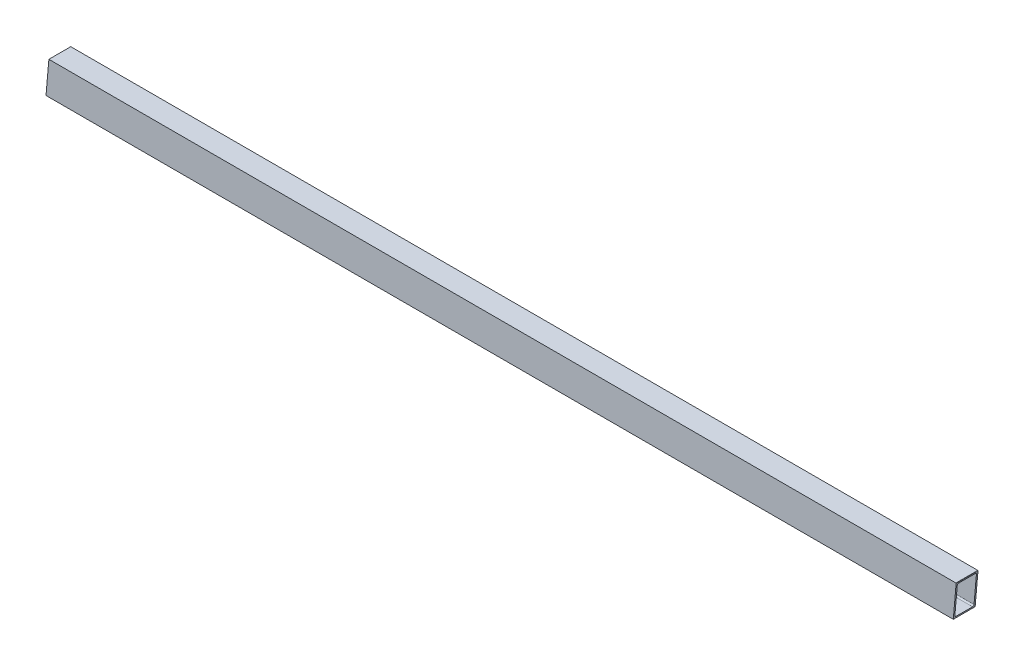
ISO-10303-21;
HEADER;
FILE_DESCRIPTION(('STEP AP214'),'2;1');
FILE_NAME('part.step','',(''),(''),'','','');
FILE_SCHEMA(('AUTOMOTIVE_DESIGN { 1 0 10303 214 1 1 1 1 }'));
ENDSEC;
DATA;
#1=APPLICATION_CONTEXT('core data for automotive mechanical design processes');
#2=APPLICATION_PROTOCOL_DEFINITION('international standard','automotive_design',2000,#1);
#3=PRODUCT_CONTEXT('',#1,'mechanical');
#4=PRODUCT('Part','Part','',(#3));
#5=PRODUCT_RELATED_PRODUCT_CATEGORY('part','',(#4));
#6=PRODUCT_DEFINITION_FORMATION('','',#4);
#7=PRODUCT_DEFINITION_CONTEXT('part definition',#1,'design');
#8=PRODUCT_DEFINITION('design','',#6,#7);
#9=PRODUCT_DEFINITION_SHAPE('','',#8);
#10=(LENGTH_UNIT() NAMED_UNIT(*) SI_UNIT(.MILLI.,.METRE.));
#11=(NAMED_UNIT(*) PLANE_ANGLE_UNIT() SI_UNIT($,.RADIAN.));
#12=(NAMED_UNIT(*) SI_UNIT($,.STERADIAN.) SOLID_ANGLE_UNIT());
#13=UNCERTAINTY_MEASURE_WITH_UNIT(LENGTH_MEASURE(1.E-05),#10,'distance_accuracy_value','');
#14=(GEOMETRIC_REPRESENTATION_CONTEXT(3) GLOBAL_UNCERTAINTY_ASSIGNED_CONTEXT((#13)) GLOBAL_UNIT_ASSIGNED_CONTEXT((#10,
#11,#12)) REPRESENTATION_CONTEXT('',''));
#15=CARTESIAN_POINT('',(0.,0.,0.));
#16=DIRECTION('',(0.,0.,1.));
#17=DIRECTION('',(1.,0.,0.));
#18=AXIS2_PLACEMENT_3D('',#15,#16,#17);
#19=CARTESIAN_POINT('',(4214.8777653,0.,0.));
#20=DIRECTION('',(0.,0.,1.));
#21=DIRECTION('',(1.,0.,0.));
#22=AXIS2_PLACEMENT_3D('',#19,#20,#21);
#23=PLANE('',#22);
#24=DIRECTION('',(-1.,0.,0.));
#25=VECTOR('',#24,1.);
#26=CARTESIAN_POINT('',(4214.8777653,152.4,0.));
#27=LINE('',#26,#25);
#28=CARTESIAN_POINT('',(4213.78645679893,152.4,0.));
#29=VERTEX_POINT('',#28);
#30=CARTESIAN_POINT('',(0.,152.4,0.));
#31=VERTEX_POINT('',#30);
#32=EDGE_CURVE('E204',#29,#31,#27,.T.);
#33=ORIENTED_EDGE('',*,*,#32,.F.);
#34=CARTESIAN_POINT('',(4213.78645679893,151.4,0.));
#35=DIRECTION('',(0.,0.,1.));
#36=DIRECTION('',(1.,0.,0.));
#37=AXIS2_PLACEMENT_3D('',#34,#35,#36);
#38=CIRCLE('',#37,1.);
#39=CARTESIAN_POINT('',(4214.78265149702,151.312844257252,0.));
#40=VERTEX_POINT('',#39);
#41=EDGE_CURVE('E11',#29,#40,#38,.F.);
#42=ORIENTED_EDGE('',*,*,#41,.T.);
#43=DIRECTION('',(-0.0871557427476511,-0.996194698091746,0.));
#44=VECTOR('',#43,1.);
#45=CARTESIAN_POINT('',(4214.8777653,152.4,0.));
#46=LINE('',#45,#44);
#47=CARTESIAN_POINT('',(4201.54449297865,0.,0.));
#48=VERTEX_POINT('',#47);
#49=EDGE_CURVE('E163',#40,#48,#46,.T.);
#50=ORIENTED_EDGE('',*,*,#49,.T.);
#51=DIRECTION('',(-1.,0.,0.));
#52=VECTOR('',#51,1.);
#53=CARTESIAN_POINT('',(4214.8777653,0.,0.));
#54=LINE('',#53,#52);
#55=CARTESIAN_POINT('',(-13.3332723213509,0.,0.));
#56=VERTEX_POINT('',#55);
#57=EDGE_CURVE('E198',#48,#56,#54,.T.);
#58=ORIENTED_EDGE('',*,*,#57,.T.);
#59=DIRECTION('',(0.0871557427476584,0.996194698091746,0.));
#60=VECTOR('',#59,1.);
#61=CARTESIAN_POINT('',(-1.4446191098591,135.887928016742,0.));
#62=LINE('',#61,#60);
#63=EDGE_CURVE('E157',#56,#31,#62,.T.);
#64=ORIENTED_EDGE('',*,*,#63,.T.);
#65=EDGE_LOOP('',(#33,#42,#50,#58,#64));
#66=FACE_BOUND('',#65,.T.);
#67=ADVANCED_FACE('F33',(#66),#23,.F.);
#68=CARTESIAN_POINT('',(4214.8777653,152.4,0.));
#69=DIRECTION('',(0.,-1.,0.));
#70=DIRECTION('',(0.,0.,-1.));
#71=AXIS2_PLACEMENT_3D('',#68,#69,#70);
#72=PLANE('',#71);
#73=DIRECTION('',(-1.,0.,0.));
#74=VECTOR('',#73,1.);
#75=CARTESIAN_POINT('',(4214.8777653,152.4,101.6));
#76=LINE('',#75,#74);
#77=CARTESIAN_POINT('',(4213.78645679893,152.4,101.6));
#78=VERTEX_POINT('',#77);
#79=CARTESIAN_POINT('',(0.,152.4,101.6));
#80=VERTEX_POINT('',#79);
#81=EDGE_CURVE('E202',#78,#80,#76,.T.);
#82=ORIENTED_EDGE('',*,*,#81,.F.);
#83=DIRECTION('',(0.,0.,1.));
#84=VECTOR('',#83,1.);
#85=CARTESIAN_POINT('',(4213.78645679893,152.4,0.));
#86=LINE('',#85,#84);
#87=EDGE_CURVE('E41',#78,#29,#86,.F.);
#88=ORIENTED_EDGE('',*,*,#87,.T.);
#89=ORIENTED_EDGE('',*,*,#32,.T.);
#90=DIRECTION('',(0.,0.,1.));
#91=VECTOR('',#90,1.);
#92=CARTESIAN_POINT('',(0.,152.4,0.));
#93=LINE('',#92,#91);
#94=EDGE_CURVE('E195',#31,#80,#93,.T.);
#95=ORIENTED_EDGE('',*,*,#94,.T.);
#96=EDGE_LOOP('',(#82,#88,#89,#95));
#97=FACE_BOUND('',#96,.T.);
#98=ADVANCED_FACE('F235',(#97),#72,.F.);
#99=CARTESIAN_POINT('',(4214.8777653,0.,101.6));
#100=DIRECTION('',(0.,0.,-1.));
#101=DIRECTION('',(-1.,0.,0.));
#102=AXIS2_PLACEMENT_3D('',#99,#100,#101);
#103=PLANE('',#102);
#104=DIRECTION('',(-0.0871557427476511,-0.996194698091746,0.));
#105=VECTOR('',#104,1.);
#106=CARTESIAN_POINT('',(4214.8777653,152.4,101.6));
#107=LINE('',#106,#105);
#108=CARTESIAN_POINT('',(4214.78265149702,151.312844257252,101.6));
#109=VERTEX_POINT('',#108);
#110=CARTESIAN_POINT('',(4201.54449297865,0.,101.6));
#111=VERTEX_POINT('',#110);
#112=EDGE_CURVE('E166',#109,#111,#107,.T.);
#113=ORIENTED_EDGE('',*,*,#112,.F.);
#114=CARTESIAN_POINT('',(4213.78645679893,151.4,101.6));
#115=DIRECTION('',(0.,0.,-1.));
#116=DIRECTION('',(-1.,0.,0.));
#117=AXIS2_PLACEMENT_3D('',#114,#115,#116);
#118=CIRCLE('',#117,1.);
#119=EDGE_CURVE('E55',#109,#78,#118,.F.);
#120=ORIENTED_EDGE('',*,*,#119,.T.);
#121=ORIENTED_EDGE('',*,*,#81,.T.);
#122=DIRECTION('',(-0.0871557427476584,-0.996194698091746,0.));
#123=VECTOR('',#122,1.);
#124=CARTESIAN_POINT('',(-14.6766102480792,-15.3544227627883,101.6));
#125=LINE('',#124,#123);
#126=CARTESIAN_POINT('',(-13.3332723213508,0.,101.6));
#127=VERTEX_POINT('',#126);
#128=EDGE_CURVE('E150',#80,#127,#125,.T.);
#129=ORIENTED_EDGE('',*,*,#128,.T.);
#130=DIRECTION('',(-1.,0.,0.));
#131=VECTOR('',#130,1.);
#132=CARTESIAN_POINT('',(4214.8777653,0.,101.6));
#133=LINE('',#132,#131);
#134=EDGE_CURVE('E200',#111,#127,#133,.T.);
#135=ORIENTED_EDGE('',*,*,#134,.F.);
#136=EDGE_LOOP('',(#113,#120,#121,#129,#135));
#137=FACE_BOUND('',#136,.T.);
#138=ADVANCED_FACE('F219',(#137),#103,.F.);
#139=CARTESIAN_POINT('',(4214.8777653,0.,0.));
#140=DIRECTION('',(0.,1.,0.));
#141=DIRECTION('',(0.,0.,1.));
#142=AXIS2_PLACEMENT_3D('',#139,#140,#141);
#143=PLANE('',#142);
#144=ORIENTED_EDGE('',*,*,#57,.F.);
#145=DIRECTION('',(0.,0.,1.));
#146=VECTOR('',#145,1.);
#147=CARTESIAN_POINT('',(4201.54449297865,0.,0.));
#148=LINE('',#147,#146);
#149=EDGE_CURVE('E165',#48,#111,#148,.T.);
#150=ORIENTED_EDGE('',*,*,#149,.T.);
#151=ORIENTED_EDGE('',*,*,#134,.T.);
#152=DIRECTION('',(0.,0.,-1.));
#153=VECTOR('',#152,1.);
#154=CARTESIAN_POINT('',(-13.3332723213509,0.,0.));
#155=LINE('',#154,#153);
#156=EDGE_CURVE('E154',#127,#56,#155,.T.);
#157=ORIENTED_EDGE('',*,*,#156,.T.);
#158=EDGE_LOOP('',(#144,#150,#151,#157));
#159=FACE_BOUND('',#158,.T.);
#160=ADVANCED_FACE('F224',(#159),#143,.F.);
#161=CARTESIAN_POINT('',(4214.8777653,12.7,88.9));
#162=DIRECTION('',(-1.,0.,0.));
#163=DIRECTION('',(0.,0.,1.));
#164=AXIS2_PLACEMENT_3D('',#161,#162,#163);
#165=CYLINDRICAL_SURFACE('',#164,6.35);
#166=CARTESIAN_POINT('',(4202.65559900543,12.7,88.9));
#167=DIRECTION('',(-0.996194698091746,0.0871557427476511,0.));
#168=DIRECTION('',(-0.0871557427476511,-0.996194698091746,0.));
#169=AXIS2_PLACEMENT_3D('',#166,#167,#168);
#170=ELLIPSE('',#169,6.37425596840025,6.35);
#171=CARTESIAN_POINT('',(4202.10004599204,6.34999999999999,88.9));
#172=VERTEX_POINT('',#171);
#173=CARTESIAN_POINT('',(4202.65559900543,12.7,95.25));
#174=VERTEX_POINT('',#173);
#175=EDGE_CURVE('E181',#172,#174,#170,.T.);
#176=ORIENTED_EDGE('',*,*,#175,.F.);
#177=DIRECTION('',(-1.,0.,0.));
#178=VECTOR('',#177,1.);
#179=CARTESIAN_POINT('',(4214.8777653,6.34999999999999,88.9));
#180=LINE('',#179,#178);
#181=CARTESIAN_POINT('',(-12.7777193079612,6.35000000000001,88.9));
#182=VERTEX_POINT('',#181);
#183=EDGE_CURVE('E193',#172,#182,#180,.T.);
#184=ORIENTED_EDGE('',*,*,#183,.T.);
#185=CARTESIAN_POINT('',(-12.2221662945716,12.7,88.9));
#186=DIRECTION('',(0.996194698091746,-0.0871557427476584,0.));
#187=DIRECTION('',(0.0871557427476584,0.996194698091746,0.));
#188=AXIS2_PLACEMENT_3D('',#185,#186,#187);
#189=ELLIPSE('',#188,6.37425596840025,6.35);
#190=CARTESIAN_POINT('',(-12.2221662945716,12.7,95.25));
#191=VERTEX_POINT('',#190);
#192=EDGE_CURVE('E280',#191,#182,#189,.T.);
#193=ORIENTED_EDGE('',*,*,#192,.F.);
#194=DIRECTION('',(-1.,0.,0.));
#195=VECTOR('',#194,1.);
#196=CARTESIAN_POINT('',(4214.8777653,12.7,95.25));
#197=LINE('',#196,#195);
#198=EDGE_CURVE('E137',#174,#191,#197,.T.);
#199=ORIENTED_EDGE('',*,*,#198,.F.);
#200=EDGE_LOOP('',(#176,#184,#193,#199));
#201=FACE_BOUND('',#200,.T.);
#202=ADVANCED_FACE('F245',(#201),#165,.F.);
#203=CARTESIAN_POINT('',(4214.8777653,6.35,12.7));
#204=DIRECTION('',(0.,1.,0.));
#205=DIRECTION('',(0.,0.,1.));
#206=AXIS2_PLACEMENT_3D('',#203,#204,#205);
#207=PLANE('',#206);
#208=DIRECTION('',(0.,0.,1.));
#209=VECTOR('',#208,1.);
#210=CARTESIAN_POINT('',(4202.10004599204,6.35,12.7));
#211=LINE('',#210,#209);
#212=CARTESIAN_POINT('',(4202.10004599204,6.35,12.7));
#213=VERTEX_POINT('',#212);
#214=EDGE_CURVE('E179',#213,#172,#211,.T.);
#215=ORIENTED_EDGE('',*,*,#214,.F.);
#216=DIRECTION('',(-1.,0.,0.));
#217=VECTOR('',#216,1.);
#218=CARTESIAN_POINT('',(4214.8777653,6.35,12.7));
#219=LINE('',#218,#217);
#220=CARTESIAN_POINT('',(-12.7777193079612,6.35,12.7));
#221=VERTEX_POINT('',#220);
#222=EDGE_CURVE('E191',#213,#221,#219,.T.);
#223=ORIENTED_EDGE('',*,*,#222,.T.);
#224=DIRECTION('',(0.,0.,-1.));
#225=VECTOR('',#224,1.);
#226=CARTESIAN_POINT('',(-12.7777193079612,6.35,12.7));
#227=LINE('',#226,#225);
#228=EDGE_CURVE('E283',#182,#221,#227,.T.);
#229=ORIENTED_EDGE('',*,*,#228,.F.);
#230=ORIENTED_EDGE('',*,*,#183,.F.);
#231=EDGE_LOOP('',(#215,#223,#229,#230));
#232=FACE_BOUND('',#231,.T.);
#233=ADVANCED_FACE('F248',(#232),#207,.T.);
#234=CARTESIAN_POINT('',(4214.8777653,12.7,12.7));
#235=DIRECTION('',(-1.,0.,0.));
#236=DIRECTION('',(0.,0.,1.));
#237=AXIS2_PLACEMENT_3D('',#234,#235,#236);
#238=CYLINDRICAL_SURFACE('',#237,6.35);
#239=CARTESIAN_POINT('',(4202.65559900543,12.7,12.7));
#240=DIRECTION('',(-0.996194698091746,0.0871557427476511,0.));
#241=DIRECTION('',(-0.0871557427476511,-0.996194698091746,0.));
#242=AXIS2_PLACEMENT_3D('',#239,#240,#241);
#243=ELLIPSE('',#242,6.37425596840025,6.35);
#244=CARTESIAN_POINT('',(4202.65559900543,12.7,6.35));
#245=VERTEX_POINT('',#244);
#246=EDGE_CURVE('E177',#245,#213,#243,.T.);
#247=ORIENTED_EDGE('',*,*,#246,.F.);
#248=DIRECTION('',(-1.,0.,0.));
#249=VECTOR('',#248,1.);
#250=CARTESIAN_POINT('',(4214.8777653,12.7,6.35));
#251=LINE('',#250,#249);
#252=CARTESIAN_POINT('',(-12.2221662945716,12.7,6.35000000000002));
#253=VERTEX_POINT('',#252);
#254=EDGE_CURVE('E189',#245,#253,#251,.T.);
#255=ORIENTED_EDGE('',*,*,#254,.T.);
#256=CARTESIAN_POINT('',(-12.2221662945716,12.7,12.7));
#257=DIRECTION('',(0.996194698091746,-0.0871557427476584,0.));
#258=DIRECTION('',(0.0871557427476584,0.996194698091746,0.));
#259=AXIS2_PLACEMENT_3D('',#256,#257,#258);
#260=ELLIPSE('',#259,6.37425596840025,6.35);
#261=EDGE_CURVE('E285',#221,#253,#260,.T.);
#262=ORIENTED_EDGE('',*,*,#261,.F.);
#263=ORIENTED_EDGE('',*,*,#222,.F.);
#264=EDGE_LOOP('',(#247,#255,#262,#263));
#265=FACE_BOUND('',#264,.T.);
#266=ADVANCED_FACE('F252',(#265),#238,.F.);
#267=CARTESIAN_POINT('',(4214.8777653,12.7,6.35));
#268=DIRECTION('',(0.,0.,1.));
#269=DIRECTION('',(0.,-1.,0.));
#270=AXIS2_PLACEMENT_3D('',#267,#268,#269);
#271=PLANE('',#270);
#272=DIRECTION('',(-0.0871557427476511,-0.996194698091746,0.));
#273=VECTOR('',#272,1.);
#274=CARTESIAN_POINT('',(4202.74844008997,13.7611784520971,6.35));
#275=LINE('',#274,#273);
#276=CARTESIAN_POINT('',(4213.76665927322,139.7,6.34999999999999));
#277=VERTEX_POINT('',#276);
#278=EDGE_CURVE('E175',#277,#245,#275,.T.);
#279=ORIENTED_EDGE('',*,*,#278,.F.);
#280=DIRECTION('',(-1.,0.,0.));
#281=VECTOR('',#280,1.);
#282=CARTESIAN_POINT('',(4214.8777653,139.7,6.34999999999999));
#283=LINE('',#282,#281);
#284=CARTESIAN_POINT('',(-1.11110602677923,139.7,6.35));
#285=VERTEX_POINT('',#284);
#286=EDGE_CURVE('E187',#277,#285,#283,.T.);
#287=ORIENTED_EDGE('',*,*,#286,.T.);
#288=DIRECTION('',(0.0871557427476584,0.996194698091746,0.));
#289=VECTOR('',#288,1.);
#290=CARTESIAN_POINT('',(-2.54728503804411,123.284398785114,6.35));
#291=LINE('',#290,#289);
#292=EDGE_CURVE('E290',#253,#285,#291,.T.);
#293=ORIENTED_EDGE('',*,*,#292,.F.);
#294=ORIENTED_EDGE('',*,*,#254,.F.);
#295=EDGE_LOOP('',(#279,#287,#293,#294));
#296=FACE_BOUND('',#295,.T.);
#297=ADVANCED_FACE('F256',(#296),#271,.T.);
#298=CARTESIAN_POINT('',(4214.8777653,139.7,12.7));
#299=DIRECTION('',(-1.,0.,0.));
#300=DIRECTION('',(0.,0.,1.));
#301=AXIS2_PLACEMENT_3D('',#298,#299,#300);
#302=CYLINDRICAL_SURFACE('',#301,6.35000000000001);
#303=CARTESIAN_POINT('',(4213.76665927322,139.7,12.7));
#304=DIRECTION('',(-0.996194698091746,0.0871557427476511,0.));
#305=DIRECTION('',(-0.0871557427476511,-0.996194698091746,0.));
#306=AXIS2_PLACEMENT_3D('',#303,#304,#305);
#307=ELLIPSE('',#306,6.37425596840026,6.35000000000001);
#308=CARTESIAN_POINT('',(4214.32221228661,146.05,12.7));
#309=VERTEX_POINT('',#308);
#310=EDGE_CURVE('E173',#309,#277,#307,.T.);
#311=ORIENTED_EDGE('',*,*,#310,.F.);
#312=DIRECTION('',(-1.,0.,0.));
#313=VECTOR('',#312,1.);
#314=CARTESIAN_POINT('',(4214.8777653,146.05,12.7));
#315=LINE('',#314,#313);
#316=CARTESIAN_POINT('',(-0.555553013389609,146.05,12.7));
#317=VERTEX_POINT('',#316);
#318=EDGE_CURVE('E185',#309,#317,#315,.T.);
#319=ORIENTED_EDGE('',*,*,#318,.T.);
#320=CARTESIAN_POINT('',(-1.11110602677925,139.7,12.7));
#321=DIRECTION('',(0.996194698091746,-0.0871557427476584,0.));
#322=DIRECTION('',(0.0871557427476584,0.996194698091746,0.));
#323=AXIS2_PLACEMENT_3D('',#320,#321,#322);
#324=ELLIPSE('',#323,6.37425596840025,6.35);
#325=EDGE_CURVE('E293',#285,#317,#324,.T.);
#326=ORIENTED_EDGE('',*,*,#325,.F.);
#327=ORIENTED_EDGE('',*,*,#286,.F.);
#328=EDGE_LOOP('',(#311,#319,#326,#327));
#329=FACE_BOUND('',#328,.T.);
#330=ADVANCED_FACE('F260',(#329),#302,.F.);
#331=CARTESIAN_POINT('',(4214.8777653,146.05,12.7));
#332=DIRECTION('',(0.,-1.,0.));
#333=DIRECTION('',(0.,0.,-1.));
#334=AXIS2_PLACEMENT_3D('',#331,#332,#333);
#335=PLANE('',#334);
#336=DIRECTION('',(0.,0.,-1.));
#337=VECTOR('',#336,1.);
#338=CARTESIAN_POINT('',(4214.32221228661,146.05,12.7));
#339=LINE('',#338,#337);
#340=CARTESIAN_POINT('',(4214.32221228661,146.05,88.9));
#341=VERTEX_POINT('',#340);
#342=EDGE_CURVE('E171',#341,#309,#339,.T.);
#343=ORIENTED_EDGE('',*,*,#342,.F.);
#344=DIRECTION('',(-1.,0.,0.));
#345=VECTOR('',#344,1.);
#346=CARTESIAN_POINT('',(4214.8777653,146.05,88.9));
#347=LINE('',#346,#345);
#348=CARTESIAN_POINT('',(-0.555553013389609,146.05,88.9));
#349=VERTEX_POINT('',#348);
#350=EDGE_CURVE('E136',#341,#349,#347,.T.);
#351=ORIENTED_EDGE('',*,*,#350,.T.);
#352=DIRECTION('',(0.,0.,1.));
#353=VECTOR('',#352,1.);
#354=CARTESIAN_POINT('',(-0.555553013389609,146.05,88.9));
#355=LINE('',#354,#353);
#356=EDGE_CURVE('E149',#317,#349,#355,.T.);
#357=ORIENTED_EDGE('',*,*,#356,.F.);
#358=ORIENTED_EDGE('',*,*,#318,.F.);
#359=EDGE_LOOP('',(#343,#351,#357,#358));
#360=FACE_BOUND('',#359,.T.);
#361=ADVANCED_FACE('F264',(#360),#335,.T.);
#362=CARTESIAN_POINT('',(4214.8777653,139.7,88.9));
#363=DIRECTION('',(-1.,0.,0.));
#364=DIRECTION('',(0.,0.,1.));
#365=AXIS2_PLACEMENT_3D('',#362,#363,#364);
#366=CYLINDRICAL_SURFACE('',#365,6.34999999999999);
#367=CARTESIAN_POINT('',(4213.76665927322,139.7,88.9));
#368=DIRECTION('',(-0.996194698091746,0.0871557427476511,0.));
#369=DIRECTION('',(-0.0871557427476511,-0.996194698091746,0.));
#370=AXIS2_PLACEMENT_3D('',#367,#368,#369);
#371=ELLIPSE('',#370,6.37425596840025,6.34999999999999);
#372=CARTESIAN_POINT('',(4213.76665927322,139.7,95.25));
#373=VERTEX_POINT('',#372);
#374=EDGE_CURVE('E132',#373,#341,#371,.T.);
#375=ORIENTED_EDGE('',*,*,#374,.F.);
#376=DIRECTION('',(-1.,0.,0.));
#377=VECTOR('',#376,1.);
#378=CARTESIAN_POINT('',(4214.8777653,139.7,95.25));
#379=LINE('',#378,#377);
#380=CARTESIAN_POINT('',(-1.11110602677923,139.7,95.25));
#381=VERTEX_POINT('',#380);
#382=EDGE_CURVE('E127',#373,#381,#379,.T.);
#383=ORIENTED_EDGE('',*,*,#382,.T.);
#384=CARTESIAN_POINT('',(-1.11110602677925,139.7,88.9));
#385=DIRECTION('',(0.996194698091746,-0.0871557427476584,0.));
#386=DIRECTION('',(0.0871557427476584,0.996194698091746,0.));
#387=AXIS2_PLACEMENT_3D('',#384,#385,#386);
#388=ELLIPSE('',#387,6.37425596840024,6.34999999999998);
#389=EDGE_CURVE('E131',#349,#381,#388,.T.);
#390=ORIENTED_EDGE('',*,*,#389,.F.);
#391=ORIENTED_EDGE('',*,*,#350,.F.);
#392=EDGE_LOOP('',(#375,#383,#390,#391));
#393=FACE_BOUND('',#392,.T.);
#394=ADVANCED_FACE('F129',(#393),#366,.F.);
#395=CARTESIAN_POINT('',(4214.8777653,12.7,95.25));
#396=DIRECTION('',(0.,0.,-1.));
#397=DIRECTION('',(-1.,0.,0.));
#398=AXIS2_PLACEMENT_3D('',#395,#396,#397);
#399=PLANE('',#398);
#400=DIRECTION('',(0.0871557427476511,0.996194698091746,0.));
#401=VECTOR('',#400,1.);
#402=CARTESIAN_POINT('',(4202.74844008997,13.7611784520971,95.25));
#403=LINE('',#402,#401);
#404=EDGE_CURVE('E206',#174,#373,#403,.T.);
#405=ORIENTED_EDGE('',*,*,#404,.F.);
#406=ORIENTED_EDGE('',*,*,#198,.T.);
#407=DIRECTION('',(-0.0871557427476584,-0.996194698091746,0.));
#408=VECTOR('',#407,1.);
#409=CARTESIAN_POINT('',(-13.5739443198942,-2.7508935311608,95.25));
#410=LINE('',#409,#408);
#411=EDGE_CURVE('E145',#381,#191,#410,.T.);
#412=ORIENTED_EDGE('',*,*,#411,.F.);
#413=ORIENTED_EDGE('',*,*,#382,.F.);
#414=EDGE_LOOP('',(#405,#406,#412,#413));
#415=FACE_BOUND('',#414,.T.);
#416=ADVANCED_FACE('F152',(#415),#399,.T.);
#417=CARTESIAN_POINT('',(4214.8777653,152.4,0.));
#418=DIRECTION('',(-0.996194698091746,0.0871557427476511,0.));
#419=DIRECTION('',(-0.0871557427476511,-0.996194698091746,0.));
#420=AXIS2_PLACEMENT_3D('',#417,#418,#419);
#421=PLANE('',#420);
#422=ORIENTED_EDGE('',*,*,#175,.T.);
#423=ORIENTED_EDGE('',*,*,#404,.T.);
#424=ORIENTED_EDGE('',*,*,#374,.T.);
#425=ORIENTED_EDGE('',*,*,#342,.T.);
#426=ORIENTED_EDGE('',*,*,#310,.T.);
#427=ORIENTED_EDGE('',*,*,#278,.T.);
#428=ORIENTED_EDGE('',*,*,#246,.T.);
#429=ORIENTED_EDGE('',*,*,#214,.T.);
#430=EDGE_LOOP('',(#422,#423,#424,#425,#426,#427,#428,#429));
#431=FACE_BOUND('',#430,.T.);
#432=ORIENTED_EDGE('',*,*,#49,.F.);
#433=DIRECTION('',(0.,0.,1.));
#434=VECTOR('',#433,1.);
#435=CARTESIAN_POINT('',(4214.78265149702,151.312844257252,0.));
#436=LINE('',#435,#434);
#437=EDGE_CURVE('E208',#40,#109,#436,.T.);
#438=ORIENTED_EDGE('',*,*,#437,.T.);
#439=ORIENTED_EDGE('',*,*,#112,.T.);
#440=ORIENTED_EDGE('',*,*,#149,.F.);
#441=EDGE_LOOP('',(#432,#438,#439,#440));
#442=FACE_BOUND('',#441,.T.);
#443=ADVANCED_FACE('F214',(#431,#442),#421,.F.);
#444=CARTESIAN_POINT('',(-13.2319911382201,1.15764922046975,0.));
#445=DIRECTION('',(0.996194698091746,-0.0871557427476584,0.));
#446=DIRECTION('',(0.0871557427476584,0.996194698091746,0.));
#447=AXIS2_PLACEMENT_3D('',#444,#445,#446);
#448=PLANE('',#447);
#449=ORIENTED_EDGE('',*,*,#389,.T.);
#450=ORIENTED_EDGE('',*,*,#411,.T.);
#451=ORIENTED_EDGE('',*,*,#192,.T.);
#452=ORIENTED_EDGE('',*,*,#228,.T.);
#453=ORIENTED_EDGE('',*,*,#261,.T.);
#454=ORIENTED_EDGE('',*,*,#292,.T.);
#455=ORIENTED_EDGE('',*,*,#325,.T.);
#456=ORIENTED_EDGE('',*,*,#356,.T.);
#457=EDGE_LOOP('',(#449,#450,#451,#452,#453,#454,#455,#456));
#458=FACE_BOUND('',#457,.T.);
#459=ORIENTED_EDGE('',*,*,#63,.F.);
#460=ORIENTED_EDGE('',*,*,#156,.F.);
#461=ORIENTED_EDGE('',*,*,#128,.F.);
#462=ORIENTED_EDGE('',*,*,#94,.F.);
#463=EDGE_LOOP('',(#459,#460,#461,#462));
#464=FACE_BOUND('',#463,.T.);
#465=ADVANCED_FACE('F142',(#458,#464),#448,.F.);
#466=CARTESIAN_POINT('',(4213.78645679893,151.4,0.));
#467=DIRECTION('',(0.,0.,1.));
#468=DIRECTION('',(0.,-1.,0.));
#469=AXIS2_PLACEMENT_3D('',#466,#467,#468);
#470=CYLINDRICAL_SURFACE('',#469,1.);
#471=ORIENTED_EDGE('',*,*,#41,.F.);
#472=ORIENTED_EDGE('',*,*,#87,.F.);
#473=ORIENTED_EDGE('',*,*,#119,.F.);
#474=ORIENTED_EDGE('',*,*,#437,.F.);
#475=EDGE_LOOP('',(#471,#472,#473,#474));
#476=FACE_BOUND('',#475,.T.);
#477=ADVANCED_FACE('F35',(#476),#470,.T.);
#478=CLOSED_SHELL('',(#67,#98,#138,#160,#202,#233,#266,#297,#330,#361,#394,#416,#443,#465,#477));
#479=MANIFOLD_SOLID_BREP('B2',#478);
#480=ADVANCED_BREP_SHAPE_REPRESENTATION('',(#18,#479),#14);
#481=SHAPE_DEFINITION_REPRESENTATION(#9,#480);
ENDSEC;
END-ISO-10303-21;
